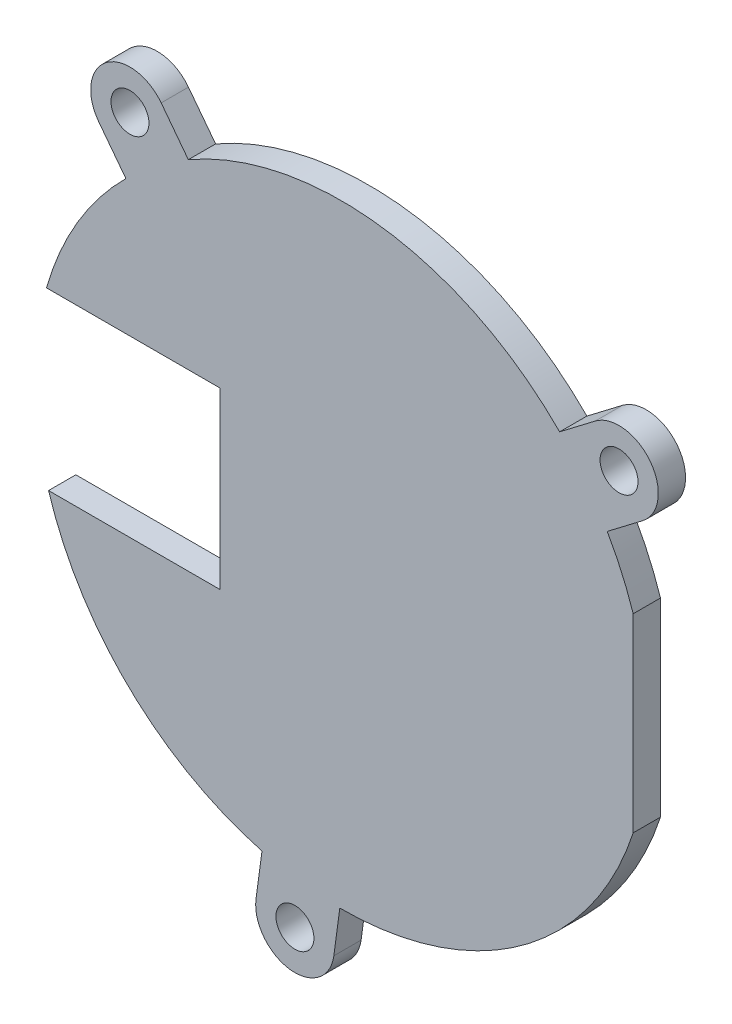
ISO-10303-21;
HEADER;
FILE_DESCRIPTION(('STEP AP214'),'2;1');
FILE_NAME('part.step','',(''),(''),'','','');
FILE_SCHEMA(('AUTOMOTIVE_DESIGN { 1 0 10303 214 1 1 1 1 }'));
ENDSEC;
DATA;
#1=APPLICATION_CONTEXT('core data for automotive mechanical design processes');
#2=APPLICATION_PROTOCOL_DEFINITION('international standard','automotive_design',2000,#1);
#3=PRODUCT_CONTEXT('',#1,'mechanical');
#4=PRODUCT('Part','Part','',(#3));
#5=PRODUCT_RELATED_PRODUCT_CATEGORY('part','',(#4));
#6=PRODUCT_DEFINITION_FORMATION('','',#4);
#7=PRODUCT_DEFINITION_CONTEXT('part definition',#1,'design');
#8=PRODUCT_DEFINITION('design','',#6,#7);
#9=PRODUCT_DEFINITION_SHAPE('','',#8);
#10=(LENGTH_UNIT() NAMED_UNIT(*) SI_UNIT(.MILLI.,.METRE.));
#11=(NAMED_UNIT(*) PLANE_ANGLE_UNIT() SI_UNIT($,.RADIAN.));
#12=(NAMED_UNIT(*) SI_UNIT($,.STERADIAN.) SOLID_ANGLE_UNIT());
#13=UNCERTAINTY_MEASURE_WITH_UNIT(LENGTH_MEASURE(1.E-05),#10,'distance_accuracy_value','');
#14=(GEOMETRIC_REPRESENTATION_CONTEXT(3) GLOBAL_UNCERTAINTY_ASSIGNED_CONTEXT((#13)) GLOBAL_UNIT_ASSIGNED_CONTEXT((#10,
#11,#12)) REPRESENTATION_CONTEXT('',''));
#15=CARTESIAN_POINT('',(0.,0.,0.));
#16=DIRECTION('',(0.,0.,1.));
#17=DIRECTION('',(1.,0.,0.));
#18=AXIS2_PLACEMENT_3D('',#15,#16,#17);
#19=CARTESIAN_POINT('',(0.,0.,1.5875));
#20=DIRECTION('',(0.,0.,1.));
#21=DIRECTION('',(1.,0.,0.));
#22=AXIS2_PLACEMENT_3D('',#19,#20,#21);
#23=PLANE('',#22);
#24=CARTESIAN_POINT('',(-12.3201482350228,16.1590948839056,1.5875));
#25=DIRECTION('',(0.,0.,1.));
#26=DIRECTION('',(1.,0.,0.));
#27=AXIS2_PLACEMENT_3D('',#24,#25,#26);
#28=CIRCLE('',#27,1.1049);
#29=CARTESIAN_POINT('',(-11.2152482350228,16.1590948839056,1.5875));
#30=VERTEX_POINT('',#29);
#31=EDGE_CURVE('E365',#30,#30,#28,.T.);
#32=ORIENTED_EDGE('',*,*,#31,.F.);
#33=EDGE_LOOP('',(#32));
#34=FACE_BOUND('',#33,.T.);
#35=DIRECTION('',(0.,-1.,0.));
#36=VECTOR('',#35,1.);
#37=CARTESIAN_POINT('',(-7.08496533764944,4.8768,1.5875));
#38=LINE('',#37,#36);
#39=CARTESIAN_POINT('',(-7.08496533764944,4.8768,1.5875));
#40=VERTEX_POINT('',#39);
#41=CARTESIAN_POINT('',(-7.08496533764946,-5.2832,1.5875));
#42=VERTEX_POINT('',#41);
#43=EDGE_CURVE('E225',#40,#42,#38,.T.);
#44=ORIENTED_EDGE('',*,*,#43,.T.);
#45=DIRECTION('',(-1.,0.,0.));
#46=VECTOR('',#45,1.);
#47=CARTESIAN_POINT('',(-17.060660873368,-5.2832,1.5875));
#48=LINE('',#47,#46);
#49=CARTESIAN_POINT('',(-17.060660873368,-5.28319999999999,1.5875));
#50=VERTEX_POINT('',#49);
#51=EDGE_CURVE('E123',#42,#50,#48,.T.);
#52=ORIENTED_EDGE('',*,*,#51,.T.);
#53=CARTESIAN_POINT('',(0.,0.,1.5875));
#54=DIRECTION('',(0.,0.,1.));
#55=DIRECTION('',(1.,0.,0.));
#56=AXIS2_PLACEMENT_3D('',#53,#54,#55);
#57=CIRCLE('',#56,17.8599650524873);
#58=CARTESIAN_POINT('',(-4.63179470211924,-17.2489080672804,1.5875));
#59=VERTEX_POINT('',#58);
#60=EDGE_CURVE('E270',#50,#59,#57,.T.);
#61=ORIENTED_EDGE('',*,*,#60,.T.);
#62=DIRECTION('',(-0.133589823230236,-0.991036709274341,0.));
#63=VECTOR('',#62,1.);
#64=CARTESIAN_POINT('',(-4.98005512543954,-19.8324795965503,1.5875));
#65=LINE('',#64,#63);
#66=CARTESIAN_POINT('',(-4.98005512543954,-19.8324795965503,1.5875));
#67=VERTEX_POINT('',#66);
#68=EDGE_CURVE('E289',#59,#67,#65,.T.);
#69=ORIENTED_EDGE('',*,*,#68,.T.);
#70=CARTESIAN_POINT('',(-2.71454520803841,-20.1378659324546,1.5875));
#71=DIRECTION('',(0.,0.,1.));
#72=DIRECTION('',(1.,0.,0.));
#73=AXIS2_PLACEMENT_3D('',#70,#71,#72);
#74=CIRCLE('',#73,2.28599999999999);
#75=CARTESIAN_POINT('',(-0.449035290637272,-20.4432522683589,1.5875));
#76=VERTEX_POINT('',#75);
#77=EDGE_CURVE('E286',#67,#76,#74,.T.);
#78=ORIENTED_EDGE('',*,*,#77,.T.);
#79=DIRECTION('',(0.133589823230237,0.991036709274341,0.));
#80=VECTOR('',#79,1.);
#81=CARTESIAN_POINT('',(-0.100774867316969,-17.859680739089,1.5875));
#82=LINE('',#81,#80);
#83=CARTESIAN_POINT('',(-0.10077486731697,-17.859680739089,1.5875));
#84=VERTEX_POINT('',#83);
#85=EDGE_CURVE('E288',#76,#84,#82,.T.);
#86=ORIENTED_EDGE('',*,*,#85,.T.);
#87=CARTESIAN_POINT('',(0.,0.,1.5875));
#88=DIRECTION('',(0.,0.,1.));
#89=DIRECTION('',(1.,0.,0.));
#90=AXIS2_PLACEMENT_3D('',#87,#88,#89);
#91=CIRCLE('',#90,17.8599650524873);
#92=CARTESIAN_POINT('',(16.9840587441892,-5.5245,1.5875));
#93=VERTEX_POINT('',#92);
#94=EDGE_CURVE('E291',#84,#93,#91,.T.);
#95=ORIENTED_EDGE('',*,*,#94,.T.);
#96=DIRECTION('',(0.,1.,0.));
#97=VECTOR('',#96,1.);
#98=CARTESIAN_POINT('',(16.9840587441892,-5.5245,1.5875));
#99=LINE('',#98,#97);
#100=CARTESIAN_POINT('',(16.9840587441892,5.5245,1.5875));
#101=VERTEX_POINT('',#100);
#102=EDGE_CURVE('E297',#93,#101,#99,.T.);
#103=ORIENTED_EDGE('',*,*,#102,.T.);
#104=CARTESIAN_POINT('',(0.,0.,1.5875));
#105=DIRECTION('',(0.,0.,1.));
#106=DIRECTION('',(1.,0.,0.));
#107=AXIS2_PLACEMENT_3D('',#104,#105,#106);
#108=CIRCLE('',#107,17.8599650524873);
#109=CARTESIAN_POINT('',(15.4719933053697,8.92164641950483,1.5875));
#110=VERTEX_POINT('',#109);
#111=EDGE_CURVE('E299',#101,#110,#108,.T.);
#112=ORIENTED_EDGE('',*,*,#111,.T.);
#113=DIRECTION('',(0.7952310474363,0.606306507629074,0.));
#114=VECTOR('',#113,1.);
#115=CARTESIAN_POINT('',(17.5451115603457,10.5022500605834,1.5875));
#116=LINE('',#115,#114);
#117=CARTESIAN_POINT('',(17.5451115603457,10.5022500605834,1.5875));
#118=VERTEX_POINT('',#117);
#119=EDGE_CURVE('E301',#110,#118,#116,.T.);
#120=ORIENTED_EDGE('',*,*,#119,.T.);
#121=CARTESIAN_POINT('',(16.1590948839056,12.3201482350228,1.5875));
#122=DIRECTION('',(0.,0.,1.));
#123=DIRECTION('',(1.,0.,0.));
#124=AXIS2_PLACEMENT_3D('',#121,#122,#123);
#125=CIRCLE('',#124,2.286);
#126=CARTESIAN_POINT('',(14.7730782074655,14.1380464094622,1.5875));
#127=VERTEX_POINT('',#126);
#128=EDGE_CURVE('E303',#118,#127,#125,.T.);
#129=ORIENTED_EDGE('',*,*,#128,.T.);
#130=DIRECTION('',(-0.7952310474363,-0.606306507629075,0.));
#131=VECTOR('',#130,1.);
#132=CARTESIAN_POINT('',(14.7730782074655,14.1380464094622,1.5875));
#133=LINE('',#132,#131);
#134=CARTESIAN_POINT('',(12.6999599524896,12.5574427683836,1.5875));
#135=VERTEX_POINT('',#134);
#136=EDGE_CURVE('E305',#127,#135,#133,.T.);
#137=ORIENTED_EDGE('',*,*,#136,.T.);
#138=CARTESIAN_POINT('',(0.,0.,1.5875));
#139=DIRECTION('',(0.,0.,1.));
#140=DIRECTION('',(1.,0.,0.));
#141=AXIS2_PLACEMENT_3D('',#138,#139,#140);
#142=CIRCLE('',#141,17.8599650524873);
#143=CARTESIAN_POINT('',(-8.92164641950484,15.4719933053697,1.5875));
#144=VERTEX_POINT('',#143);
#145=EDGE_CURVE('E307',#135,#144,#142,.T.);
#146=ORIENTED_EDGE('',*,*,#145,.T.);
#147=DIRECTION('',(-0.606306507629075,0.7952310474363,0.));
#148=VECTOR('',#147,1.);
#149=CARTESIAN_POINT('',(-8.92164641950484,15.4719933053697,1.5875));
#150=LINE('',#149,#148);
#151=CARTESIAN_POINT('',(-10.5022500605834,17.5451115603457,1.5875));
#152=VERTEX_POINT('',#151);
#153=EDGE_CURVE('E309',#144,#152,#150,.T.);
#154=ORIENTED_EDGE('',*,*,#153,.T.);
#155=CARTESIAN_POINT('',(-12.3201482350228,16.1590948839056,1.5875));
#156=DIRECTION('',(0.,0.,1.));
#157=DIRECTION('',(1.,0.,0.));
#158=AXIS2_PLACEMENT_3D('',#155,#156,#157);
#159=CIRCLE('',#158,2.28599999999999);
#160=CARTESIAN_POINT('',(-14.1380464094622,14.7730782074656,1.5875));
#161=VERTEX_POINT('',#160);
#162=EDGE_CURVE('E172',#152,#161,#159,.T.);
#163=ORIENTED_EDGE('',*,*,#162,.T.);
#164=DIRECTION('',(0.606306507629074,-0.795231047436301,0.));
#165=VECTOR('',#164,1.);
#166=CARTESIAN_POINT('',(-14.1380464094622,14.7730782074656,1.5875));
#167=LINE('',#166,#165);
#168=CARTESIAN_POINT('',(-12.5574427683836,12.6999599524896,1.5875));
#169=VERTEX_POINT('',#168);
#170=EDGE_CURVE('E166',#161,#169,#167,.T.);
#171=ORIENTED_EDGE('',*,*,#170,.T.);
#172=CARTESIAN_POINT('',(0.,0.,1.5875));
#173=DIRECTION('',(0.,0.,1.));
#174=DIRECTION('',(1.,0.,0.));
#175=AXIS2_PLACEMENT_3D('',#172,#173,#174);
#176=CIRCLE('',#175,17.8599650524873);
#177=CARTESIAN_POINT('',(-17.1812448162544,4.8768,1.5875));
#178=VERTEX_POINT('',#177);
#179=EDGE_CURVE('E170',#169,#178,#176,.T.);
#180=ORIENTED_EDGE('',*,*,#179,.T.);
#181=DIRECTION('',(1.,0.,0.));
#182=VECTOR('',#181,1.);
#183=CARTESIAN_POINT('',(-7.08496533764944,4.8768,1.5875));
#184=LINE('',#183,#182);
#185=EDGE_CURVE('E50',#178,#40,#184,.T.);
#186=ORIENTED_EDGE('',*,*,#185,.T.);
#187=EDGE_LOOP('',(#44,#52,#61,#69,#78,#86,#95,#103,#112,#120,#129,#137,#146,#154,#163,#171,
#180,#186));
#188=FACE_BOUND('',#187,.T.);
#189=CARTESIAN_POINT('',(-2.71454520803841,-20.1378659324546,1.5875));
#190=DIRECTION('',(0.,0.,1.));
#191=DIRECTION('',(1.,0.,0.));
#192=AXIS2_PLACEMENT_3D('',#189,#190,#191);
#193=CIRCLE('',#192,1.1049);
#194=CARTESIAN_POINT('',(-1.60964520803841,-20.1378659324546,1.5875));
#195=VERTEX_POINT('',#194);
#196=EDGE_CURVE('E194',#195,#195,#193,.T.);
#197=ORIENTED_EDGE('',*,*,#196,.F.);
#198=EDGE_LOOP('',(#197));
#199=FACE_BOUND('',#198,.T.);
#200=CARTESIAN_POINT('',(16.1590948839056,12.3201482350228,1.5875));
#201=DIRECTION('',(0.,0.,1.));
#202=DIRECTION('',(1.,0.,0.));
#203=AXIS2_PLACEMENT_3D('',#200,#201,#202);
#204=CIRCLE('',#203,1.1049);
#205=CARTESIAN_POINT('',(17.2639948839056,12.3201482350228,1.5875));
#206=VERTEX_POINT('',#205);
#207=EDGE_CURVE('E356',#206,#206,#204,.T.);
#208=ORIENTED_EDGE('',*,*,#207,.F.);
#209=EDGE_LOOP('',(#208));
#210=FACE_BOUND('',#209,.T.);
#211=ADVANCED_FACE('F33',(#34,#188,#199,#210),#23,.T.);
#212=CARTESIAN_POINT('',(0.,0.,0.));
#213=DIRECTION('',(0.,0.,1.));
#214=DIRECTION('',(1.,0.,0.));
#215=AXIS2_PLACEMENT_3D('',#212,#213,#214);
#216=PLANE('',#215);
#217=CARTESIAN_POINT('',(-12.3201482350228,16.1590948839056,0.));
#218=DIRECTION('',(0.,0.,1.));
#219=DIRECTION('',(1.,0.,0.));
#220=AXIS2_PLACEMENT_3D('',#217,#218,#219);
#221=CIRCLE('',#220,1.1049);
#222=CARTESIAN_POINT('',(-11.2152482350228,16.1590948839056,0.));
#223=VERTEX_POINT('',#222);
#224=EDGE_CURVE('E362',#223,#223,#221,.T.);
#225=ORIENTED_EDGE('',*,*,#224,.T.);
#226=EDGE_LOOP('',(#225));
#227=FACE_BOUND('',#226,.T.);
#228=DIRECTION('',(0.,-1.,0.));
#229=VECTOR('',#228,1.);
#230=CARTESIAN_POINT('',(-7.08496533764944,4.8768,0.));
#231=LINE('',#230,#229);
#232=CARTESIAN_POINT('',(-7.08496533764944,4.8768,0.));
#233=VERTEX_POINT('',#232);
#234=CARTESIAN_POINT('',(-7.08496533764946,-5.2832,0.));
#235=VERTEX_POINT('',#234);
#236=EDGE_CURVE('E190',#233,#235,#231,.T.);
#237=ORIENTED_EDGE('',*,*,#236,.F.);
#238=DIRECTION('',(1.,0.,0.));
#239=VECTOR('',#238,1.);
#240=CARTESIAN_POINT('',(-7.08496533764944,4.8768,0.));
#241=LINE('',#240,#239);
#242=CARTESIAN_POINT('',(-17.1812448162544,4.8768,0.));
#243=VERTEX_POINT('',#242);
#244=EDGE_CURVE('E115',#243,#233,#241,.T.);
#245=ORIENTED_EDGE('',*,*,#244,.F.);
#246=CARTESIAN_POINT('',(0.,0.,0.));
#247=DIRECTION('',(0.,0.,1.));
#248=DIRECTION('',(1.,0.,0.));
#249=AXIS2_PLACEMENT_3D('',#246,#247,#248);
#250=CIRCLE('',#249,17.8599650524873);
#251=CARTESIAN_POINT('',(-12.5574427683836,12.6999599524896,0.));
#252=VERTEX_POINT('',#251);
#253=EDGE_CURVE('E109',#252,#243,#250,.T.);
#254=ORIENTED_EDGE('',*,*,#253,.F.);
#255=DIRECTION('',(0.606306507629074,-0.795231047436301,0.));
#256=VECTOR('',#255,1.);
#257=CARTESIAN_POINT('',(-14.1380464094622,14.7730782074656,0.));
#258=LINE('',#257,#256);
#259=CARTESIAN_POINT('',(-14.1380464094622,14.7730782074656,0.));
#260=VERTEX_POINT('',#259);
#261=EDGE_CURVE('E180',#260,#252,#258,.T.);
#262=ORIENTED_EDGE('',*,*,#261,.F.);
#263=CARTESIAN_POINT('',(-12.3201482350228,16.1590948839056,0.));
#264=DIRECTION('',(0.,0.,1.));
#265=DIRECTION('',(1.,0.,0.));
#266=AXIS2_PLACEMENT_3D('',#263,#264,#265);
#267=CIRCLE('',#266,2.28599999999999);
#268=CARTESIAN_POINT('',(-10.5022500605834,17.5451115603457,0.));
#269=VERTEX_POINT('',#268);
#270=EDGE_CURVE('E220',#269,#260,#267,.T.);
#271=ORIENTED_EDGE('',*,*,#270,.F.);
#272=DIRECTION('',(-0.606306507629075,0.7952310474363,0.));
#273=VECTOR('',#272,1.);
#274=CARTESIAN_POINT('',(-8.92164641950484,15.4719933053697,0.));
#275=LINE('',#274,#273);
#276=CARTESIAN_POINT('',(-8.92164641950484,15.4719933053697,0.));
#277=VERTEX_POINT('',#276);
#278=EDGE_CURVE('E218',#277,#269,#275,.T.);
#279=ORIENTED_EDGE('',*,*,#278,.F.);
#280=CARTESIAN_POINT('',(0.,0.,0.));
#281=DIRECTION('',(0.,0.,1.));
#282=DIRECTION('',(1.,0.,0.));
#283=AXIS2_PLACEMENT_3D('',#280,#281,#282);
#284=CIRCLE('',#283,17.8599650524873);
#285=CARTESIAN_POINT('',(12.6999599524896,12.5574427683836,0.));
#286=VERTEX_POINT('',#285);
#287=EDGE_CURVE('E216',#286,#277,#284,.T.);
#288=ORIENTED_EDGE('',*,*,#287,.F.);
#289=DIRECTION('',(-0.7952310474363,-0.606306507629075,0.));
#290=VECTOR('',#289,1.);
#291=CARTESIAN_POINT('',(14.7730782074655,14.1380464094622,0.));
#292=LINE('',#291,#290);
#293=CARTESIAN_POINT('',(14.7730782074655,14.1380464094622,0.));
#294=VERTEX_POINT('',#293);
#295=EDGE_CURVE('E214',#294,#286,#292,.T.);
#296=ORIENTED_EDGE('',*,*,#295,.F.);
#297=CARTESIAN_POINT('',(16.1590948839056,12.3201482350228,0.));
#298=DIRECTION('',(0.,0.,1.));
#299=DIRECTION('',(1.,0.,0.));
#300=AXIS2_PLACEMENT_3D('',#297,#298,#299);
#301=CIRCLE('',#300,2.286);
#302=CARTESIAN_POINT('',(17.5451115603457,10.5022500605834,0.));
#303=VERTEX_POINT('',#302);
#304=EDGE_CURVE('E212',#303,#294,#301,.T.);
#305=ORIENTED_EDGE('',*,*,#304,.F.);
#306=DIRECTION('',(0.7952310474363,0.606306507629074,0.));
#307=VECTOR('',#306,1.);
#308=CARTESIAN_POINT('',(17.5451115603457,10.5022500605834,0.));
#309=LINE('',#308,#307);
#310=CARTESIAN_POINT('',(15.4719933053697,8.92164641950483,0.));
#311=VERTEX_POINT('',#310);
#312=EDGE_CURVE('E210',#311,#303,#309,.T.);
#313=ORIENTED_EDGE('',*,*,#312,.F.);
#314=CARTESIAN_POINT('',(0.,0.,0.));
#315=DIRECTION('',(0.,0.,1.));
#316=DIRECTION('',(1.,0.,0.));
#317=AXIS2_PLACEMENT_3D('',#314,#315,#316);
#318=CIRCLE('',#317,17.8599650524873);
#319=CARTESIAN_POINT('',(16.9840587441892,5.5245,0.));
#320=VERTEX_POINT('',#319);
#321=EDGE_CURVE('E208',#320,#311,#318,.T.);
#322=ORIENTED_EDGE('',*,*,#321,.F.);
#323=DIRECTION('',(0.,1.,0.));
#324=VECTOR('',#323,1.);
#325=CARTESIAN_POINT('',(16.9840587441892,-5.5245,0.));
#326=LINE('',#325,#324);
#327=CARTESIAN_POINT('',(16.9840587441892,-5.5245,0.));
#328=VERTEX_POINT('',#327);
#329=EDGE_CURVE('E206',#328,#320,#326,.T.);
#330=ORIENTED_EDGE('',*,*,#329,.F.);
#331=CARTESIAN_POINT('',(0.,0.,0.));
#332=DIRECTION('',(0.,0.,1.));
#333=DIRECTION('',(1.,0.,0.));
#334=AXIS2_PLACEMENT_3D('',#331,#332,#333);
#335=CIRCLE('',#334,17.8599650524873);
#336=CARTESIAN_POINT('',(-0.10077486731697,-17.859680739089,0.));
#337=VERTEX_POINT('',#336);
#338=EDGE_CURVE('E204',#337,#328,#335,.T.);
#339=ORIENTED_EDGE('',*,*,#338,.F.);
#340=DIRECTION('',(0.133589823230237,0.991036709274341,0.));
#341=VECTOR('',#340,1.);
#342=CARTESIAN_POINT('',(-0.100774867316969,-17.859680739089,0.));
#343=LINE('',#342,#341);
#344=CARTESIAN_POINT('',(-0.449035290637272,-20.4432522683589,0.));
#345=VERTEX_POINT('',#344);
#346=EDGE_CURVE('E202',#345,#337,#343,.T.);
#347=ORIENTED_EDGE('',*,*,#346,.F.);
#348=CARTESIAN_POINT('',(-2.71454520803841,-20.1378659324546,0.));
#349=DIRECTION('',(0.,0.,1.));
#350=DIRECTION('',(1.,0.,0.));
#351=AXIS2_PLACEMENT_3D('',#348,#349,#350);
#352=CIRCLE('',#351,2.28599999999999);
#353=CARTESIAN_POINT('',(-4.98005512543954,-19.8324795965503,0.));
#354=VERTEX_POINT('',#353);
#355=EDGE_CURVE('E200',#354,#345,#352,.T.);
#356=ORIENTED_EDGE('',*,*,#355,.F.);
#357=DIRECTION('',(-0.133589823230236,-0.991036709274341,0.));
#358=VECTOR('',#357,1.);
#359=CARTESIAN_POINT('',(-4.98005512543954,-19.8324795965503,0.));
#360=LINE('',#359,#358);
#361=CARTESIAN_POINT('',(-4.63179470211924,-17.2489080672804,0.));
#362=VERTEX_POINT('',#361);
#363=EDGE_CURVE('E198',#362,#354,#360,.T.);
#364=ORIENTED_EDGE('',*,*,#363,.F.);
#365=CARTESIAN_POINT('',(0.,0.,0.));
#366=DIRECTION('',(0.,0.,1.));
#367=DIRECTION('',(1.,0.,0.));
#368=AXIS2_PLACEMENT_3D('',#365,#366,#367);
#369=CIRCLE('',#368,17.8599650524873);
#370=CARTESIAN_POINT('',(-17.060660873368,-5.28319999999999,0.));
#371=VERTEX_POINT('',#370);
#372=EDGE_CURVE('E196',#371,#362,#369,.T.);
#373=ORIENTED_EDGE('',*,*,#372,.F.);
#374=DIRECTION('',(-1.,0.,0.));
#375=VECTOR('',#374,1.);
#376=CARTESIAN_POINT('',(-17.060660873368,-5.2832,0.));
#377=LINE('',#376,#375);
#378=EDGE_CURVE('E193',#235,#371,#377,.T.);
#379=ORIENTED_EDGE('',*,*,#378,.F.);
#380=EDGE_LOOP('',(#237,#245,#254,#262,#271,#279,#288,#296,#305,#313,#322,#330,#339,#347,#356,
#364,#373,#379));
#381=FACE_BOUND('',#380,.T.);
#382=CARTESIAN_POINT('',(-2.71454520803841,-20.1378659324546,0.));
#383=DIRECTION('',(0.,0.,1.));
#384=DIRECTION('',(1.,0.,0.));
#385=AXIS2_PLACEMENT_3D('',#382,#383,#384);
#386=CIRCLE('',#385,1.1049);
#387=CARTESIAN_POINT('',(-1.60964520803841,-20.1378659324546,0.));
#388=VERTEX_POINT('',#387);
#389=EDGE_CURVE('E368',#388,#388,#386,.T.);
#390=ORIENTED_EDGE('',*,*,#389,.T.);
#391=EDGE_LOOP('',(#390));
#392=FACE_BOUND('',#391,.T.);
#393=CARTESIAN_POINT('',(16.1590948839056,12.3201482350228,0.));
#394=DIRECTION('',(0.,0.,1.));
#395=DIRECTION('',(1.,0.,0.));
#396=AXIS2_PLACEMENT_3D('',#393,#394,#395);
#397=CIRCLE('',#396,1.1049);
#398=CARTESIAN_POINT('',(17.2639948839056,12.3201482350228,0.));
#399=VERTEX_POINT('',#398);
#400=EDGE_CURVE('E359',#399,#399,#397,.T.);
#401=ORIENTED_EDGE('',*,*,#400,.T.);
#402=EDGE_LOOP('',(#401));
#403=FACE_BOUND('',#402,.T.);
#404=ADVANCED_FACE('F274',(#227,#381,#392,#403),#216,.F.);
#405=CARTESIAN_POINT('',(-7.08496533764944,4.8768,1.5875));
#406=DIRECTION('',(1.,0.,0.));
#407=DIRECTION('',(0.,1.,0.));
#408=AXIS2_PLACEMENT_3D('',#405,#406,#407);
#409=PLANE('',#408);
#410=ORIENTED_EDGE('',*,*,#236,.T.);
#411=DIRECTION('',(0.,0.,-1.));
#412=VECTOR('',#411,1.);
#413=CARTESIAN_POINT('',(-7.08496533764946,-5.2832,1.5875));
#414=LINE('',#413,#412);
#415=EDGE_CURVE('E11',#42,#235,#414,.T.);
#416=ORIENTED_EDGE('',*,*,#415,.F.);
#417=ORIENTED_EDGE('',*,*,#43,.F.);
#418=DIRECTION('',(0.,0.,-1.));
#419=VECTOR('',#418,1.);
#420=CARTESIAN_POINT('',(-7.08496533764944,4.8768,1.5875));
#421=LINE('',#420,#419);
#422=EDGE_CURVE('E186',#40,#233,#421,.T.);
#423=ORIENTED_EDGE('',*,*,#422,.T.);
#424=EDGE_LOOP('',(#410,#416,#417,#423));
#425=FACE_BOUND('',#424,.T.);
#426=ADVANCED_FACE('F35',(#425),#409,.F.);
#427=CARTESIAN_POINT('',(-17.060660873368,-5.2832,1.5875));
#428=DIRECTION('',(0.,-1.,0.));
#429=DIRECTION('',(1.,0.,0.));
#430=AXIS2_PLACEMENT_3D('',#427,#428,#429);
#431=PLANE('',#430);
#432=ORIENTED_EDGE('',*,*,#378,.T.);
#433=DIRECTION('',(0.,0.,-1.));
#434=VECTOR('',#433,1.);
#435=CARTESIAN_POINT('',(-17.060660873368,-5.28319999999999,1.5875));
#436=LINE('',#435,#434);
#437=EDGE_CURVE('E42',#50,#371,#436,.T.);
#438=ORIENTED_EDGE('',*,*,#437,.F.);
#439=ORIENTED_EDGE('',*,*,#51,.F.);
#440=ORIENTED_EDGE('',*,*,#415,.T.);
#441=EDGE_LOOP('',(#432,#438,#439,#440));
#442=FACE_BOUND('',#441,.T.);
#443=ADVANCED_FACE('F529',(#442),#431,.F.);
#444=CARTESIAN_POINT('',(0.,0.,1.5875));
#445=DIRECTION('',(0.,0.,-1.));
#446=DIRECTION('',(-1.,0.,0.));
#447=AXIS2_PLACEMENT_3D('',#444,#445,#446);
#448=CYLINDRICAL_SURFACE('',#447,17.8599650524873);
#449=ORIENTED_EDGE('',*,*,#372,.T.);
#450=DIRECTION('',(0.,0.,-1.));
#451=VECTOR('',#450,1.);
#452=CARTESIAN_POINT('',(-4.63179470211924,-17.2489080672804,1.5875));
#453=LINE('',#452,#451);
#454=EDGE_CURVE('E262',#59,#362,#453,.T.);
#455=ORIENTED_EDGE('',*,*,#454,.F.);
#456=ORIENTED_EDGE('',*,*,#60,.F.);
#457=ORIENTED_EDGE('',*,*,#437,.T.);
#458=EDGE_LOOP('',(#449,#455,#456,#457));
#459=FACE_BOUND('',#458,.T.);
#460=ADVANCED_FACE('F268',(#459),#448,.T.);
#461=CARTESIAN_POINT('',(-4.98005512543954,-19.8324795965503,1.5875));
#462=DIRECTION('',(0.991036709274341,-0.133589823230236,0.));
#463=DIRECTION('',(0.133589823230236,0.991036709274341,0.));
#464=AXIS2_PLACEMENT_3D('',#461,#462,#463);
#465=PLANE('',#464);
#466=ORIENTED_EDGE('',*,*,#363,.T.);
#467=DIRECTION('',(0.,0.,-1.));
#468=VECTOR('',#467,1.);
#469=CARTESIAN_POINT('',(-4.98005512543954,-19.8324795965503,1.5875));
#470=LINE('',#469,#468);
#471=EDGE_CURVE('E259',#67,#354,#470,.T.);
#472=ORIENTED_EDGE('',*,*,#471,.F.);
#473=ORIENTED_EDGE('',*,*,#68,.F.);
#474=ORIENTED_EDGE('',*,*,#454,.T.);
#475=EDGE_LOOP('',(#466,#472,#473,#474));
#476=FACE_BOUND('',#475,.T.);
#477=ADVANCED_FACE('F280',(#476),#465,.F.);
#478=CARTESIAN_POINT('',(-2.71454520803841,-20.1378659324546,1.5875));
#479=DIRECTION('',(0.,0.,-1.));
#480=DIRECTION('',(-1.,0.,0.));
#481=AXIS2_PLACEMENT_3D('',#478,#479,#480);
#482=CYLINDRICAL_SURFACE('',#481,2.28599999999999);
#483=ORIENTED_EDGE('',*,*,#355,.T.);
#484=DIRECTION('',(0.,0.,-1.));
#485=VECTOR('',#484,1.);
#486=CARTESIAN_POINT('',(-0.449035290637272,-20.4432522683589,1.5875));
#487=LINE('',#486,#485);
#488=EDGE_CURVE('E256',#76,#345,#487,.T.);
#489=ORIENTED_EDGE('',*,*,#488,.F.);
#490=ORIENTED_EDGE('',*,*,#77,.F.);
#491=ORIENTED_EDGE('',*,*,#471,.T.);
#492=EDGE_LOOP('',(#483,#489,#490,#491));
#493=FACE_BOUND('',#492,.T.);
#494=ADVANCED_FACE('F284',(#493),#482,.T.);
#495=CARTESIAN_POINT('',(-0.100774867316969,-17.859680739089,1.5875));
#496=DIRECTION('',(-0.991036709274341,0.133589823230237,0.));
#497=DIRECTION('',(-0.133589823230237,-0.991036709274341,0.));
#498=AXIS2_PLACEMENT_3D('',#495,#496,#497);
#499=PLANE('',#498);
#500=ORIENTED_EDGE('',*,*,#346,.T.);
#501=DIRECTION('',(0.,0.,-1.));
#502=VECTOR('',#501,1.);
#503=CARTESIAN_POINT('',(-0.10077486731697,-17.859680739089,1.5875));
#504=LINE('',#503,#502);
#505=EDGE_CURVE('E253',#84,#337,#504,.T.);
#506=ORIENTED_EDGE('',*,*,#505,.F.);
#507=ORIENTED_EDGE('',*,*,#85,.F.);
#508=ORIENTED_EDGE('',*,*,#488,.T.);
#509=EDGE_LOOP('',(#500,#506,#507,#508));
#510=FACE_BOUND('',#509,.T.);
#511=ADVANCED_FACE('F494',(#510),#499,.F.);
#512=CARTESIAN_POINT('',(0.,0.,1.5875));
#513=DIRECTION('',(0.,0.,-1.));
#514=DIRECTION('',(-1.,0.,0.));
#515=AXIS2_PLACEMENT_3D('',#512,#513,#514);
#516=CYLINDRICAL_SURFACE('',#515,17.8599650524873);
#517=ORIENTED_EDGE('',*,*,#338,.T.);
#518=DIRECTION('',(0.,0.,-1.));
#519=VECTOR('',#518,1.);
#520=CARTESIAN_POINT('',(16.9840587441892,-5.5245,1.5875));
#521=LINE('',#520,#519);
#522=EDGE_CURVE('E250',#93,#328,#521,.T.);
#523=ORIENTED_EDGE('',*,*,#522,.F.);
#524=ORIENTED_EDGE('',*,*,#94,.F.);
#525=ORIENTED_EDGE('',*,*,#505,.T.);
#526=EDGE_LOOP('',(#517,#523,#524,#525));
#527=FACE_BOUND('',#526,.T.);
#528=ADVANCED_FACE('F484',(#527),#516,.T.);
#529=CARTESIAN_POINT('',(16.9840587441892,-5.5245,1.5875));
#530=DIRECTION('',(-1.,0.,0.));
#531=DIRECTION('',(0.,-1.,0.));
#532=AXIS2_PLACEMENT_3D('',#529,#530,#531);
#533=PLANE('',#532);
#534=ORIENTED_EDGE('',*,*,#329,.T.);
#535=DIRECTION('',(0.,0.,-1.));
#536=VECTOR('',#535,1.);
#537=CARTESIAN_POINT('',(16.9840587441892,5.5245,1.5875));
#538=LINE('',#537,#536);
#539=EDGE_CURVE('E247',#101,#320,#538,.T.);
#540=ORIENTED_EDGE('',*,*,#539,.F.);
#541=ORIENTED_EDGE('',*,*,#102,.F.);
#542=ORIENTED_EDGE('',*,*,#522,.T.);
#543=EDGE_LOOP('',(#534,#540,#541,#542));
#544=FACE_BOUND('',#543,.T.);
#545=ADVANCED_FACE('F474',(#544),#533,.F.);
#546=CARTESIAN_POINT('',(0.,0.,1.5875));
#547=DIRECTION('',(0.,0.,-1.));
#548=DIRECTION('',(-1.,0.,0.));
#549=AXIS2_PLACEMENT_3D('',#546,#547,#548);
#550=CYLINDRICAL_SURFACE('',#549,17.8599650524873);
#551=ORIENTED_EDGE('',*,*,#321,.T.);
#552=DIRECTION('',(0.,0.,-1.));
#553=VECTOR('',#552,1.);
#554=CARTESIAN_POINT('',(15.4719933053697,8.92164641950483,1.5875));
#555=LINE('',#554,#553);
#556=EDGE_CURVE('E244',#110,#311,#555,.T.);
#557=ORIENTED_EDGE('',*,*,#556,.F.);
#558=ORIENTED_EDGE('',*,*,#111,.F.);
#559=ORIENTED_EDGE('',*,*,#539,.T.);
#560=EDGE_LOOP('',(#551,#557,#558,#559));
#561=FACE_BOUND('',#560,.T.);
#562=ADVANCED_FACE('F464',(#561),#550,.T.);
#563=CARTESIAN_POINT('',(17.5451115603457,10.5022500605834,1.5875));
#564=DIRECTION('',(-0.606306507629074,0.7952310474363,0.));
#565=DIRECTION('',(-0.7952310474363,-0.606306507629074,0.));
#566=AXIS2_PLACEMENT_3D('',#563,#564,#565);
#567=PLANE('',#566);
#568=ORIENTED_EDGE('',*,*,#312,.T.);
#569=DIRECTION('',(0.,0.,-1.));
#570=VECTOR('',#569,1.);
#571=CARTESIAN_POINT('',(17.5451115603457,10.5022500605834,1.5875));
#572=LINE('',#571,#570);
#573=EDGE_CURVE('E241',#118,#303,#572,.T.);
#574=ORIENTED_EDGE('',*,*,#573,.F.);
#575=ORIENTED_EDGE('',*,*,#119,.F.);
#576=ORIENTED_EDGE('',*,*,#556,.T.);
#577=EDGE_LOOP('',(#568,#574,#575,#576));
#578=FACE_BOUND('',#577,.T.);
#579=ADVANCED_FACE('F454',(#578),#567,.F.);
#580=CARTESIAN_POINT('',(16.1590948839056,12.3201482350228,1.5875));
#581=DIRECTION('',(0.,0.,-1.));
#582=DIRECTION('',(-1.,0.,0.));
#583=AXIS2_PLACEMENT_3D('',#580,#581,#582);
#584=CYLINDRICAL_SURFACE('',#583,2.286);
#585=ORIENTED_EDGE('',*,*,#304,.T.);
#586=DIRECTION('',(0.,0.,-1.));
#587=VECTOR('',#586,1.);
#588=CARTESIAN_POINT('',(14.7730782074655,14.1380464094622,1.5875));
#589=LINE('',#588,#587);
#590=EDGE_CURVE('E238',#127,#294,#589,.T.);
#591=ORIENTED_EDGE('',*,*,#590,.F.);
#592=ORIENTED_EDGE('',*,*,#128,.F.);
#593=ORIENTED_EDGE('',*,*,#573,.T.);
#594=EDGE_LOOP('',(#585,#591,#592,#593));
#595=FACE_BOUND('',#594,.T.);
#596=ADVANCED_FACE('F444',(#595),#584,.T.);
#597=CARTESIAN_POINT('',(14.7730782074655,14.1380464094622,1.5875));
#598=DIRECTION('',(0.606306507629075,-0.7952310474363,0.));
#599=DIRECTION('',(0.7952310474363,0.606306507629075,0.));
#600=AXIS2_PLACEMENT_3D('',#597,#598,#599);
#601=PLANE('',#600);
#602=ORIENTED_EDGE('',*,*,#295,.T.);
#603=DIRECTION('',(0.,0.,-1.));
#604=VECTOR('',#603,1.);
#605=CARTESIAN_POINT('',(12.6999599524896,12.5574427683836,1.5875));
#606=LINE('',#605,#604);
#607=EDGE_CURVE('E235',#135,#286,#606,.T.);
#608=ORIENTED_EDGE('',*,*,#607,.F.);
#609=ORIENTED_EDGE('',*,*,#136,.F.);
#610=ORIENTED_EDGE('',*,*,#590,.T.);
#611=EDGE_LOOP('',(#602,#608,#609,#610));
#612=FACE_BOUND('',#611,.T.);
#613=ADVANCED_FACE('F434',(#612),#601,.F.);
#614=CARTESIAN_POINT('',(0.,0.,1.5875));
#615=DIRECTION('',(0.,0.,-1.));
#616=DIRECTION('',(-1.,0.,0.));
#617=AXIS2_PLACEMENT_3D('',#614,#615,#616);
#618=CYLINDRICAL_SURFACE('',#617,17.8599650524873);
#619=ORIENTED_EDGE('',*,*,#287,.T.);
#620=DIRECTION('',(0.,0.,-1.));
#621=VECTOR('',#620,1.);
#622=CARTESIAN_POINT('',(-8.92164641950484,15.4719933053697,1.5875));
#623=LINE('',#622,#621);
#624=EDGE_CURVE('E232',#144,#277,#623,.T.);
#625=ORIENTED_EDGE('',*,*,#624,.F.);
#626=ORIENTED_EDGE('',*,*,#145,.F.);
#627=ORIENTED_EDGE('',*,*,#607,.T.);
#628=EDGE_LOOP('',(#619,#625,#626,#627));
#629=FACE_BOUND('',#628,.T.);
#630=ADVANCED_FACE('F425',(#629),#618,.T.);
#631=CARTESIAN_POINT('',(-8.92164641950484,15.4719933053697,1.5875));
#632=DIRECTION('',(-0.7952310474363,-0.606306507629075,0.));
#633=DIRECTION('',(0.606306507629075,-0.7952310474363,0.));
#634=AXIS2_PLACEMENT_3D('',#631,#632,#633);
#635=PLANE('',#634);
#636=ORIENTED_EDGE('',*,*,#278,.T.);
#637=DIRECTION('',(0.,0.,-1.));
#638=VECTOR('',#637,1.);
#639=CARTESIAN_POINT('',(-10.5022500605834,17.5451115603457,1.5875));
#640=LINE('',#639,#638);
#641=EDGE_CURVE('E229',#152,#269,#640,.T.);
#642=ORIENTED_EDGE('',*,*,#641,.F.);
#643=ORIENTED_EDGE('',*,*,#153,.F.);
#644=ORIENTED_EDGE('',*,*,#624,.T.);
#645=EDGE_LOOP('',(#636,#642,#643,#644));
#646=FACE_BOUND('',#645,.T.);
#647=ADVANCED_FACE('F315',(#646),#635,.F.);
#648=CARTESIAN_POINT('',(-12.3201482350228,16.1590948839056,1.5875));
#649=DIRECTION('',(0.,0.,-1.));
#650=DIRECTION('',(-1.,0.,0.));
#651=AXIS2_PLACEMENT_3D('',#648,#649,#650);
#652=CYLINDRICAL_SURFACE('',#651,2.28599999999999);
#653=ORIENTED_EDGE('',*,*,#270,.T.);
#654=DIRECTION('',(0.,0.,-1.));
#655=VECTOR('',#654,1.);
#656=CARTESIAN_POINT('',(-14.1380464094622,14.7730782074656,1.5875));
#657=LINE('',#656,#655);
#658=EDGE_CURVE('E181',#161,#260,#657,.T.);
#659=ORIENTED_EDGE('',*,*,#658,.F.);
#660=ORIENTED_EDGE('',*,*,#162,.F.);
#661=ORIENTED_EDGE('',*,*,#641,.T.);
#662=EDGE_LOOP('',(#653,#659,#660,#661));
#663=FACE_BOUND('',#662,.T.);
#664=ADVANCED_FACE('F319',(#663),#652,.T.);
#665=CARTESIAN_POINT('',(-14.1380464094622,14.7730782074656,1.5875));
#666=DIRECTION('',(0.795231047436301,0.606306507629074,0.));
#667=DIRECTION('',(-0.606306507629074,0.795231047436301,0.));
#668=AXIS2_PLACEMENT_3D('',#665,#666,#667);
#669=PLANE('',#668);
#670=ORIENTED_EDGE('',*,*,#261,.T.);
#671=DIRECTION('',(0.,0.,-1.));
#672=VECTOR('',#671,1.);
#673=CARTESIAN_POINT('',(-12.5574427683836,12.6999599524896,1.5875));
#674=LINE('',#673,#672);
#675=EDGE_CURVE('E177',#169,#252,#674,.T.);
#676=ORIENTED_EDGE('',*,*,#675,.F.);
#677=ORIENTED_EDGE('',*,*,#170,.F.);
#678=ORIENTED_EDGE('',*,*,#658,.T.);
#679=EDGE_LOOP('',(#670,#676,#677,#678));
#680=FACE_BOUND('',#679,.T.);
#681=ADVANCED_FACE('F178',(#680),#669,.F.);
#682=CARTESIAN_POINT('',(0.,0.,1.5875));
#683=DIRECTION('',(0.,0.,-1.));
#684=DIRECTION('',(-1.,0.,0.));
#685=AXIS2_PLACEMENT_3D('',#682,#683,#684);
#686=CYLINDRICAL_SURFACE('',#685,17.8599650524873);
#687=ORIENTED_EDGE('',*,*,#253,.T.);
#688=DIRECTION('',(0.,0.,-1.));
#689=VECTOR('',#688,1.);
#690=CARTESIAN_POINT('',(-17.1812448162544,4.8768,1.5875));
#691=LINE('',#690,#689);
#692=EDGE_CURVE('E182',#178,#243,#691,.T.);
#693=ORIENTED_EDGE('',*,*,#692,.F.);
#694=ORIENTED_EDGE('',*,*,#179,.F.);
#695=ORIENTED_EDGE('',*,*,#675,.T.);
#696=EDGE_LOOP('',(#687,#693,#694,#695));
#697=FACE_BOUND('',#696,.T.);
#698=ADVANCED_FACE('F184',(#697),#686,.T.);
#699=CARTESIAN_POINT('',(-7.08496533764944,4.8768,1.5875));
#700=DIRECTION('',(0.,1.,0.));
#701=DIRECTION('',(-1.,0.,0.));
#702=AXIS2_PLACEMENT_3D('',#699,#700,#701);
#703=PLANE('',#702);
#704=ORIENTED_EDGE('',*,*,#244,.T.);
#705=ORIENTED_EDGE('',*,*,#422,.F.);
#706=ORIENTED_EDGE('',*,*,#185,.F.);
#707=ORIENTED_EDGE('',*,*,#692,.T.);
#708=EDGE_LOOP('',(#704,#705,#706,#707));
#709=FACE_BOUND('',#708,.T.);
#710=ADVANCED_FACE('F323',(#709),#703,.F.);
#711=CARTESIAN_POINT('',(-2.71454520803841,-20.1378659324546,1.5875));
#712=DIRECTION('',(0.,0.,-1.));
#713=DIRECTION('',(-1.,0.,0.));
#714=AXIS2_PLACEMENT_3D('',#711,#712,#713);
#715=CYLINDRICAL_SURFACE('',#714,1.1049);
#716=ORIENTED_EDGE('',*,*,#196,.T.);
#717=EDGE_LOOP('',(#716));
#718=FACE_BOUND('',#717,.T.);
#719=ORIENTED_EDGE('',*,*,#389,.F.);
#720=EDGE_LOOP('',(#719));
#721=FACE_BOUND('',#720,.T.);
#722=ADVANCED_FACE('F325',(#718,#721),#715,.F.);
#723=CARTESIAN_POINT('',(-12.3201482350228,16.1590948839056,1.5875));
#724=DIRECTION('',(0.,0.,-1.));
#725=DIRECTION('',(-1.,0.,0.));
#726=AXIS2_PLACEMENT_3D('',#723,#724,#725);
#727=CYLINDRICAL_SURFACE('',#726,1.1049);
#728=ORIENTED_EDGE('',*,*,#31,.T.);
#729=EDGE_LOOP('',(#728));
#730=FACE_BOUND('',#729,.T.);
#731=ORIENTED_EDGE('',*,*,#224,.F.);
#732=EDGE_LOOP('',(#731));
#733=FACE_BOUND('',#732,.T.);
#734=ADVANCED_FACE('F331',(#730,#733),#727,.F.);
#735=CARTESIAN_POINT('',(16.1590948839056,12.3201482350228,1.5875));
#736=DIRECTION('',(0.,0.,-1.));
#737=DIRECTION('',(-1.,0.,0.));
#738=AXIS2_PLACEMENT_3D('',#735,#736,#737);
#739=CYLINDRICAL_SURFACE('',#738,1.1049);
#740=ORIENTED_EDGE('',*,*,#207,.T.);
#741=EDGE_LOOP('',(#740));
#742=FACE_BOUND('',#741,.T.);
#743=ORIENTED_EDGE('',*,*,#400,.F.);
#744=EDGE_LOOP('',(#743));
#745=FACE_BOUND('',#744,.T.);
#746=ADVANCED_FACE('F347',(#742,#745),#739,.F.);
#747=CLOSED_SHELL('',(#211,#404,#426,#443,#460,#477,#494,#511,#528,#545,#562,#579,#596,#613,
#630,#647,#664,#681,#698,#710,#722,#734,#746));
#748=MANIFOLD_SOLID_BREP('B2',#747);
#749=ADVANCED_BREP_SHAPE_REPRESENTATION('',(#18,#748),#14);
#750=SHAPE_DEFINITION_REPRESENTATION(#9,#749);
ENDSEC;
END-ISO-10303-21;
